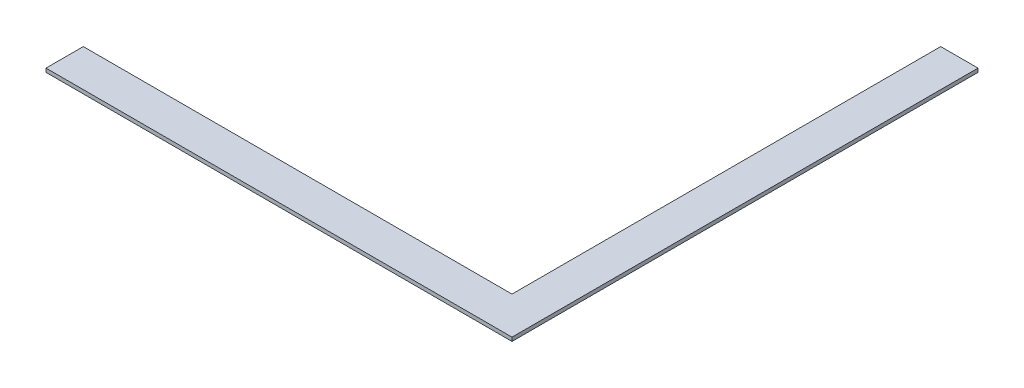
ISO-10303-21;
HEADER;
FILE_DESCRIPTION(('STEP AP214'),'2;1');
FILE_NAME('part.step','',(''),(''),'','','');
FILE_SCHEMA(('AUTOMOTIVE_DESIGN { 1 0 10303 214 1 1 1 1 }'));
ENDSEC;
DATA;
#1=APPLICATION_CONTEXT('core data for automotive mechanical design processes');
#2=APPLICATION_PROTOCOL_DEFINITION('international standard','automotive_design',2000,#1);
#3=PRODUCT_CONTEXT('',#1,'mechanical');
#4=PRODUCT('Part','Part','',(#3));
#5=PRODUCT_RELATED_PRODUCT_CATEGORY('part','',(#4));
#6=PRODUCT_DEFINITION_FORMATION('','',#4);
#7=PRODUCT_DEFINITION_CONTEXT('part definition',#1,'design');
#8=PRODUCT_DEFINITION('design','',#6,#7);
#9=PRODUCT_DEFINITION_SHAPE('','',#8);
#10=(LENGTH_UNIT() NAMED_UNIT(*) SI_UNIT(.MILLI.,.METRE.));
#11=(NAMED_UNIT(*) PLANE_ANGLE_UNIT() SI_UNIT($,.RADIAN.));
#12=(NAMED_UNIT(*) SI_UNIT($,.STERADIAN.) SOLID_ANGLE_UNIT());
#13=UNCERTAINTY_MEASURE_WITH_UNIT(LENGTH_MEASURE(1.E-05),#10,'distance_accuracy_value','');
#14=(GEOMETRIC_REPRESENTATION_CONTEXT(3) GLOBAL_UNCERTAINTY_ASSIGNED_CONTEXT((#13)) GLOBAL_UNIT_ASSIGNED_CONTEXT((#10,
#11,#12)) REPRESENTATION_CONTEXT('',''));
#15=CARTESIAN_POINT('',(0.,0.,0.));
#16=DIRECTION('',(0.,0.,1.));
#17=DIRECTION('',(1.,0.,0.));
#18=AXIS2_PLACEMENT_3D('',#15,#16,#17);
#19=CARTESIAN_POINT('',(0.,2.,-20.));
#20=DIRECTION('',(1.,0.,0.));
#21=DIRECTION('',(0.,0.,-1.));
#22=AXIS2_PLACEMENT_3D('',#19,#20,#21);
#23=PLANE('',#22);
#24=DIRECTION('',(0.,0.,1.));
#25=VECTOR('',#24,1.);
#26=CARTESIAN_POINT('',(0.,0.,-20.));
#27=LINE('',#26,#25);
#28=CARTESIAN_POINT('',(0.,0.,-20.));
#29=VERTEX_POINT('',#28);
#30=CARTESIAN_POINT('',(0.,0.,0.));
#31=VERTEX_POINT('',#30);
#32=EDGE_CURVE('E134',#29,#31,#27,.T.);
#33=ORIENTED_EDGE('',*,*,#32,.T.);
#34=DIRECTION('',(0.,-1.,0.));
#35=VECTOR('',#34,1.);
#36=CARTESIAN_POINT('',(0.,2.,0.));
#37=LINE('',#36,#35);
#38=CARTESIAN_POINT('',(0.,2.,0.));
#39=VERTEX_POINT('',#38);
#40=EDGE_CURVE('E11',#39,#31,#37,.T.);
#41=ORIENTED_EDGE('',*,*,#40,.F.);
#42=DIRECTION('',(0.,0.,1.));
#43=VECTOR('',#42,1.);
#44=CARTESIAN_POINT('',(0.,2.,-20.));
#45=LINE('',#44,#43);
#46=CARTESIAN_POINT('',(0.,2.,-20.));
#47=VERTEX_POINT('',#46);
#48=EDGE_CURVE('E150',#47,#39,#45,.T.);
#49=ORIENTED_EDGE('',*,*,#48,.F.);
#50=DIRECTION('',(0.,-1.,0.));
#51=VECTOR('',#50,1.);
#52=CARTESIAN_POINT('',(0.,2.,-20.));
#53=LINE('',#52,#51);
#54=EDGE_CURVE('E130',#47,#29,#53,.T.);
#55=ORIENTED_EDGE('',*,*,#54,.T.);
#56=EDGE_LOOP('',(#33,#41,#49,#55));
#57=FACE_BOUND('',#56,.T.);
#58=ADVANCED_FACE('F45',(#57),#23,.F.);
#59=CARTESIAN_POINT('',(0.,2.,0.));
#60=DIRECTION('',(0.,0.,-1.));
#61=DIRECTION('',(-1.,0.,0.));
#62=AXIS2_PLACEMENT_3D('',#59,#60,#61);
#63=PLANE('',#62);
#64=DIRECTION('',(1.,0.,0.));
#65=VECTOR('',#64,1.);
#66=CARTESIAN_POINT('',(0.,0.,0.));
#67=LINE('',#66,#65);
#68=CARTESIAN_POINT('',(250.,0.,0.));
#69=VERTEX_POINT('',#68);
#70=EDGE_CURVE('E138',#31,#69,#67,.T.);
#71=ORIENTED_EDGE('',*,*,#70,.T.);
#72=DIRECTION('',(0.,-1.,0.));
#73=VECTOR('',#72,1.);
#74=CARTESIAN_POINT('',(250.,2.,0.));
#75=LINE('',#74,#73);
#76=CARTESIAN_POINT('',(250.,2.,0.));
#77=VERTEX_POINT('',#76);
#78=EDGE_CURVE('E54',#77,#69,#75,.T.);
#79=ORIENTED_EDGE('',*,*,#78,.F.);
#80=DIRECTION('',(1.,0.,0.));
#81=VECTOR('',#80,1.);
#82=CARTESIAN_POINT('',(0.,2.,0.));
#83=LINE('',#82,#81);
#84=EDGE_CURVE('E99',#39,#77,#83,.T.);
#85=ORIENTED_EDGE('',*,*,#84,.F.);
#86=ORIENTED_EDGE('',*,*,#40,.T.);
#87=EDGE_LOOP('',(#71,#79,#85,#86));
#88=FACE_BOUND('',#87,.T.);
#89=ADVANCED_FACE('F178',(#88),#63,.F.);
#90=CARTESIAN_POINT('',(250.,2.,0.));
#91=DIRECTION('',(-1.,0.,0.));
#92=DIRECTION('',(0.,0.,1.));
#93=AXIS2_PLACEMENT_3D('',#90,#91,#92);
#94=PLANE('',#93);
#95=DIRECTION('',(0.,0.,-1.));
#96=VECTOR('',#95,1.);
#97=CARTESIAN_POINT('',(250.,0.,0.));
#98=LINE('',#97,#96);
#99=CARTESIAN_POINT('',(250.,0.,-250.));
#100=VERTEX_POINT('',#99);
#101=EDGE_CURVE('E141',#69,#100,#98,.T.);
#102=ORIENTED_EDGE('',*,*,#101,.T.);
#103=DIRECTION('',(0.,-1.,0.));
#104=VECTOR('',#103,1.);
#105=CARTESIAN_POINT('',(250.,2.,-250.));
#106=LINE('',#105,#104);
#107=CARTESIAN_POINT('',(250.,2.,-250.));
#108=VERTEX_POINT('',#107);
#109=EDGE_CURVE('E123',#108,#100,#106,.T.);
#110=ORIENTED_EDGE('',*,*,#109,.F.);
#111=DIRECTION('',(0.,0.,-1.));
#112=VECTOR('',#111,1.);
#113=CARTESIAN_POINT('',(250.,2.,0.));
#114=LINE('',#113,#112);
#115=EDGE_CURVE('E112',#77,#108,#114,.T.);
#116=ORIENTED_EDGE('',*,*,#115,.F.);
#117=ORIENTED_EDGE('',*,*,#78,.T.);
#118=EDGE_LOOP('',(#102,#110,#116,#117));
#119=FACE_BOUND('',#118,.T.);
#120=ADVANCED_FACE('F160',(#119),#94,.F.);
#121=CARTESIAN_POINT('',(250.,2.,-250.));
#122=DIRECTION('',(0.,0.,1.));
#123=DIRECTION('',(1.,0.,0.));
#124=AXIS2_PLACEMENT_3D('',#121,#122,#123);
#125=PLANE('',#124);
#126=DIRECTION('',(-1.,0.,0.));
#127=VECTOR('',#126,1.);
#128=CARTESIAN_POINT('',(250.,0.,-250.));
#129=LINE('',#128,#127);
#130=CARTESIAN_POINT('',(230.,0.,-250.));
#131=VERTEX_POINT('',#130);
#132=EDGE_CURVE('E121',#100,#131,#129,.T.);
#133=ORIENTED_EDGE('',*,*,#132,.T.);
#134=DIRECTION('',(0.,-1.,0.));
#135=VECTOR('',#134,1.);
#136=CARTESIAN_POINT('',(230.,2.,-250.));
#137=LINE('',#136,#135);
#138=CARTESIAN_POINT('',(230.,2.,-250.));
#139=VERTEX_POINT('',#138);
#140=EDGE_CURVE('E118',#139,#131,#137,.T.);
#141=ORIENTED_EDGE('',*,*,#140,.F.);
#142=DIRECTION('',(-1.,0.,0.));
#143=VECTOR('',#142,1.);
#144=CARTESIAN_POINT('',(250.,2.,-250.));
#145=LINE('',#144,#143);
#146=EDGE_CURVE('E106',#108,#139,#145,.T.);
#147=ORIENTED_EDGE('',*,*,#146,.F.);
#148=ORIENTED_EDGE('',*,*,#109,.T.);
#149=EDGE_LOOP('',(#133,#141,#147,#148));
#150=FACE_BOUND('',#149,.T.);
#151=ADVANCED_FACE('F119',(#150),#125,.F.);
#152=CARTESIAN_POINT('',(230.,2.,-250.));
#153=DIRECTION('',(1.,0.,0.));
#154=DIRECTION('',(0.,0.,-1.));
#155=AXIS2_PLACEMENT_3D('',#152,#153,#154);
#156=PLANE('',#155);
#157=DIRECTION('',(0.,0.,1.));
#158=VECTOR('',#157,1.);
#159=CARTESIAN_POINT('',(230.,0.,-250.));
#160=LINE('',#159,#158);
#161=CARTESIAN_POINT('',(230.,0.,-20.));
#162=VERTEX_POINT('',#161);
#163=EDGE_CURVE('E85',#131,#162,#160,.T.);
#164=ORIENTED_EDGE('',*,*,#163,.T.);
#165=DIRECTION('',(0.,-1.,0.));
#166=VECTOR('',#165,1.);
#167=CARTESIAN_POINT('',(230.,2.,-20.));
#168=LINE('',#167,#166);
#169=CARTESIAN_POINT('',(230.,2.,-20.));
#170=VERTEX_POINT('',#169);
#171=EDGE_CURVE('E124',#170,#162,#168,.T.);
#172=ORIENTED_EDGE('',*,*,#171,.F.);
#173=DIRECTION('',(0.,0.,1.));
#174=VECTOR('',#173,1.);
#175=CARTESIAN_POINT('',(230.,2.,-250.));
#176=LINE('',#175,#174);
#177=EDGE_CURVE('E110',#139,#170,#176,.T.);
#178=ORIENTED_EDGE('',*,*,#177,.F.);
#179=ORIENTED_EDGE('',*,*,#140,.T.);
#180=EDGE_LOOP('',(#164,#172,#178,#179));
#181=FACE_BOUND('',#180,.T.);
#182=ADVANCED_FACE('F126',(#181),#156,.F.);
#183=CARTESIAN_POINT('',(230.,2.,-20.));
#184=DIRECTION('',(0.,0.,1.));
#185=DIRECTION('',(1.,0.,0.));
#186=AXIS2_PLACEMENT_3D('',#183,#184,#185);
#187=PLANE('',#186);
#188=DIRECTION('',(-1.,0.,0.));
#189=VECTOR('',#188,1.);
#190=CARTESIAN_POINT('',(230.,0.,-20.));
#191=LINE('',#190,#189);
#192=EDGE_CURVE('E91',#162,#29,#191,.T.);
#193=ORIENTED_EDGE('',*,*,#192,.T.);
#194=ORIENTED_EDGE('',*,*,#54,.F.);
#195=DIRECTION('',(-1.,0.,0.));
#196=VECTOR('',#195,1.);
#197=CARTESIAN_POINT('',(230.,2.,-20.));
#198=LINE('',#197,#196);
#199=EDGE_CURVE('E62',#170,#47,#198,.T.);
#200=ORIENTED_EDGE('',*,*,#199,.F.);
#201=ORIENTED_EDGE('',*,*,#171,.T.);
#202=EDGE_LOOP('',(#193,#194,#200,#201));
#203=FACE_BOUND('',#202,.T.);
#204=ADVANCED_FACE('F167',(#203),#187,.F.);
#205=CARTESIAN_POINT('',(0.,2.,0.));
#206=DIRECTION('',(0.,1.,0.));
#207=DIRECTION('',(0.,0.,1.));
#208=AXIS2_PLACEMENT_3D('',#205,#206,#207);
#209=PLANE('',#208);
#210=ORIENTED_EDGE('',*,*,#48,.T.);
#211=ORIENTED_EDGE('',*,*,#84,.T.);
#212=ORIENTED_EDGE('',*,*,#115,.T.);
#213=ORIENTED_EDGE('',*,*,#146,.T.);
#214=ORIENTED_EDGE('',*,*,#177,.T.);
#215=ORIENTED_EDGE('',*,*,#199,.T.);
#216=EDGE_LOOP('',(#210,#211,#212,#213,#214,#215));
#217=FACE_BOUND('',#216,.T.);
#218=ADVANCED_FACE('F108',(#217),#209,.T.);
#219=CARTESIAN_POINT('',(0.,0.,0.));
#220=DIRECTION('',(0.,1.,0.));
#221=DIRECTION('',(0.,0.,1.));
#222=AXIS2_PLACEMENT_3D('',#219,#220,#221);
#223=PLANE('',#222);
#224=ORIENTED_EDGE('',*,*,#32,.F.);
#225=ORIENTED_EDGE('',*,*,#192,.F.);
#226=ORIENTED_EDGE('',*,*,#163,.F.);
#227=ORIENTED_EDGE('',*,*,#132,.F.);
#228=ORIENTED_EDGE('',*,*,#101,.F.);
#229=ORIENTED_EDGE('',*,*,#70,.F.);
#230=EDGE_LOOP('',(#224,#225,#226,#227,#228,#229));
#231=FACE_BOUND('',#230,.T.);
#232=ADVANCED_FACE('F163',(#231),#223,.F.);
#233=CLOSED_SHELL('',(#58,#89,#120,#151,#182,#204,#218,#232));
#234=MANIFOLD_SOLID_BREP('B2',#233);
#235=ADVANCED_BREP_SHAPE_REPRESENTATION('',(#18,#234),#14);
#236=SHAPE_DEFINITION_REPRESENTATION(#9,#235);
ENDSEC;
END-ISO-10303-21;
